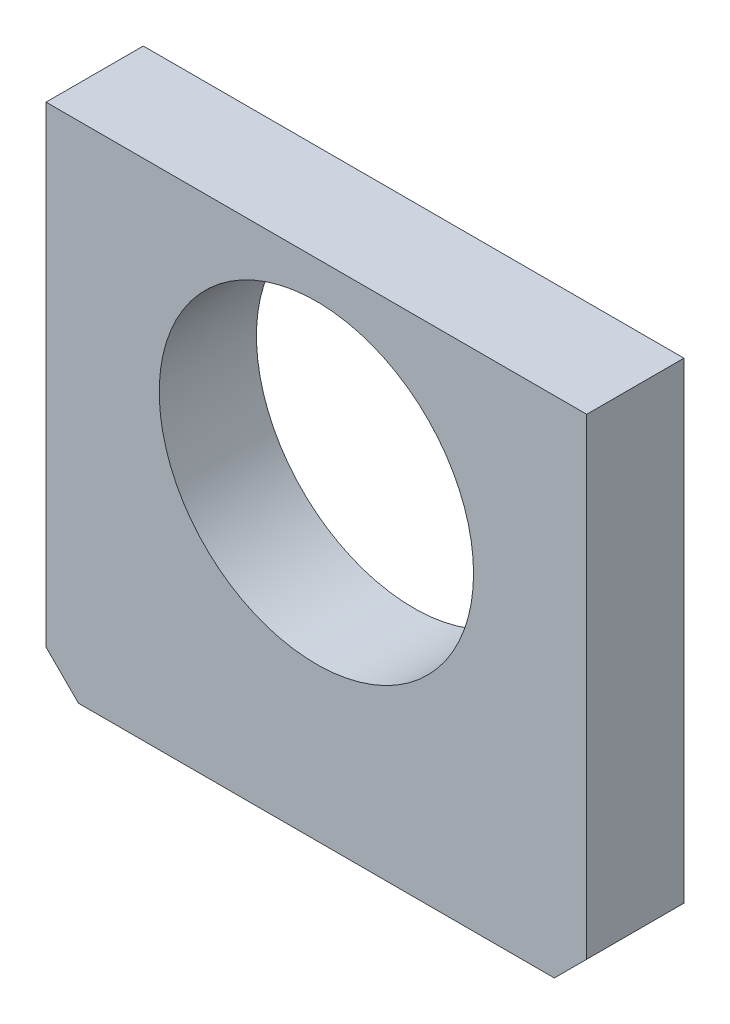
ISO-10303-21;
HEADER;
FILE_DESCRIPTION(('STEP AP214'),'2;1');
FILE_NAME('part.step','',(''),(''),'','','');
FILE_SCHEMA(('AUTOMOTIVE_DESIGN { 1 0 10303 214 1 1 1 1 }'));
ENDSEC;
DATA;
#1=APPLICATION_CONTEXT('core data for automotive mechanical design processes');
#2=APPLICATION_PROTOCOL_DEFINITION('international standard','automotive_design',2000,#1);
#3=PRODUCT_CONTEXT('',#1,'mechanical');
#4=PRODUCT('Part','Part','',(#3));
#5=PRODUCT_RELATED_PRODUCT_CATEGORY('part','',(#4));
#6=PRODUCT_DEFINITION_FORMATION('','',#4);
#7=PRODUCT_DEFINITION_CONTEXT('part definition',#1,'design');
#8=PRODUCT_DEFINITION('design','',#6,#7);
#9=PRODUCT_DEFINITION_SHAPE('','',#8);
#10=(LENGTH_UNIT() NAMED_UNIT(*) SI_UNIT(.MILLI.,.METRE.));
#11=(NAMED_UNIT(*) PLANE_ANGLE_UNIT() SI_UNIT($,.RADIAN.));
#12=(NAMED_UNIT(*) SI_UNIT($,.STERADIAN.) SOLID_ANGLE_UNIT());
#13=UNCERTAINTY_MEASURE_WITH_UNIT(LENGTH_MEASURE(1.E-05),#10,'distance_accuracy_value','');
#14=(GEOMETRIC_REPRESENTATION_CONTEXT(3) GLOBAL_UNCERTAINTY_ASSIGNED_CONTEXT((#13)) GLOBAL_UNIT_ASSIGNED_CONTEXT((#10,
#11,#12)) REPRESENTATION_CONTEXT('',''));
#15=CARTESIAN_POINT('',(0.,0.,0.));
#16=DIRECTION('',(0.,0.,1.));
#17=DIRECTION('',(1.,0.,0.));
#18=AXIS2_PLACEMENT_3D('',#15,#16,#17);
#19=CARTESIAN_POINT('',(52.9749999969755,495.506289326684,-19.05));
#20=DIRECTION('',(1.,0.,0.));
#21=DIRECTION('',(0.,1.,0.));
#22=AXIS2_PLACEMENT_3D('',#19,#20,#21);
#23=PLANE('',#22);
#24=DIRECTION('',(0.,1.,0.));
#25=VECTOR('',#24,1.);
#26=CARTESIAN_POINT('',(52.9749999969755,495.506289326684,0.));
#27=LINE('',#26,#25);
#28=CARTESIAN_POINT('',(52.9749999969745,403.012638398687,0.));
#29=VERTEX_POINT('',#28);
#30=CARTESIAN_POINT('',(52.9749999969755,495.506289326684,0.));
#31=VERTEX_POINT('',#30);
#32=EDGE_CURVE('E117',#29,#31,#27,.T.);
#33=ORIENTED_EDGE('',*,*,#32,.F.);
#34=DIRECTION('',(0.,0.,-1.));
#35=VECTOR('',#34,1.);
#36=CARTESIAN_POINT('',(52.9749999969745,403.012638398687,-19.05));
#37=LINE('',#36,#35);
#38=CARTESIAN_POINT('',(52.9749999969745,403.012638398687,-19.05));
#39=VERTEX_POINT('',#38);
#40=EDGE_CURVE('E61',#29,#39,#37,.T.);
#41=ORIENTED_EDGE('',*,*,#40,.T.);
#42=DIRECTION('',(0.,1.,0.));
#43=VECTOR('',#42,1.);
#44=CARTESIAN_POINT('',(52.9749999969755,495.506289326684,-19.05));
#45=LINE('',#44,#43);
#46=CARTESIAN_POINT('',(52.9749999969755,495.506289326684,-19.05));
#47=VERTEX_POINT('',#46);
#48=EDGE_CURVE('E92',#39,#47,#45,.T.);
#49=ORIENTED_EDGE('',*,*,#48,.T.);
#50=DIRECTION('',(0.,0.,1.));
#51=VECTOR('',#50,1.);
#52=CARTESIAN_POINT('',(52.9749999969755,495.506289326684,-19.05));
#53=LINE('',#52,#51);
#54=EDGE_CURVE('E94',#47,#31,#53,.T.);
#55=ORIENTED_EDGE('',*,*,#54,.T.);
#56=EDGE_LOOP('',(#33,#41,#49,#55));
#57=FACE_BOUND('',#56,.T.);
#58=ADVANCED_FACE('F37',(#57),#23,.T.);
#59=CARTESIAN_POINT('',(52.9749999969744,396.662638398687,-19.05));
#60=DIRECTION('',(0.,-1.,0.));
#61=DIRECTION('',(0.,0.,-1.));
#62=AXIS2_PLACEMENT_3D('',#59,#60,#61);
#63=PLANE('',#62);
#64=DIRECTION('',(1.,0.,0.));
#65=VECTOR('',#64,1.);
#66=CARTESIAN_POINT('',(52.9749999969744,396.662638398687,-19.05));
#67=LINE('',#66,#65);
#68=CARTESIAN_POINT('',(-46.6249999970027,396.662638398687,-19.05));
#69=VERTEX_POINT('',#68);
#70=CARTESIAN_POINT('',(46.6249999969743,396.662638398687,-19.05));
#71=VERTEX_POINT('',#70);
#72=EDGE_CURVE('E107',#69,#71,#67,.T.);
#73=ORIENTED_EDGE('',*,*,#72,.T.);
#74=DIRECTION('',(0.,0.,1.));
#75=VECTOR('',#74,1.);
#76=CARTESIAN_POINT('',(46.6249999969743,396.662638398687,-19.05));
#77=LINE('',#76,#75);
#78=CARTESIAN_POINT('',(46.6249999969743,396.662638398687,0.));
#79=VERTEX_POINT('',#78);
#80=EDGE_CURVE('E129',#71,#79,#77,.T.);
#81=ORIENTED_EDGE('',*,*,#80,.T.);
#82=DIRECTION('',(1.,0.,0.));
#83=VECTOR('',#82,1.);
#84=CARTESIAN_POINT('',(52.9749999969744,396.662638398687,0.));
#85=LINE('',#84,#83);
#86=CARTESIAN_POINT('',(-46.6249999970027,396.662638398687,0.));
#87=VERTEX_POINT('',#86);
#88=EDGE_CURVE('E99',#87,#79,#85,.T.);
#89=ORIENTED_EDGE('',*,*,#88,.F.);
#90=DIRECTION('',(0.,0.,-1.));
#91=VECTOR('',#90,1.);
#92=CARTESIAN_POINT('',(-46.6249999970027,396.662638398687,-19.05));
#93=LINE('',#92,#91);
#94=EDGE_CURVE('E126',#87,#69,#93,.T.);
#95=ORIENTED_EDGE('',*,*,#94,.T.);
#96=EDGE_LOOP('',(#73,#81,#89,#95));
#97=FACE_BOUND('',#96,.T.);
#98=ADVANCED_FACE('F140',(#97),#63,.T.);
#99=CARTESIAN_POINT('',(-52.9749999970028,495.506289326683,-19.05));
#100=DIRECTION('',(-1.,0.,0.));
#101=DIRECTION('',(0.,-1.,0.));
#102=AXIS2_PLACEMENT_3D('',#99,#100,#101);
#103=PLANE('',#102);
#104=DIRECTION('',(0.,-1.,0.));
#105=VECTOR('',#104,1.);
#106=CARTESIAN_POINT('',(-52.9749999970028,495.506289326683,-19.05));
#107=LINE('',#106,#105);
#108=CARTESIAN_POINT('',(-52.9749999970028,495.506289326683,-19.05));
#109=VERTEX_POINT('',#108);
#110=CARTESIAN_POINT('',(-52.9749999970027,403.012638398687,-19.05));
#111=VERTEX_POINT('',#110);
#112=EDGE_CURVE('E110',#109,#111,#107,.T.);
#113=ORIENTED_EDGE('',*,*,#112,.T.);
#114=DIRECTION('',(0.,0.,1.));
#115=VECTOR('',#114,1.);
#116=CARTESIAN_POINT('',(-52.9749999970027,403.012638398687,-19.05));
#117=LINE('',#116,#115);
#118=CARTESIAN_POINT('',(-52.9749999970027,403.012638398687,0.));
#119=VERTEX_POINT('',#118);
#120=EDGE_CURVE('E11',#111,#119,#117,.T.);
#121=ORIENTED_EDGE('',*,*,#120,.T.);
#122=DIRECTION('',(0.,-1.,0.));
#123=VECTOR('',#122,1.);
#124=CARTESIAN_POINT('',(-52.9749999970028,495.506289326683,0.));
#125=LINE('',#124,#123);
#126=CARTESIAN_POINT('',(-52.9749999970028,495.506289326683,0.));
#127=VERTEX_POINT('',#126);
#128=EDGE_CURVE('E121',#127,#119,#125,.T.);
#129=ORIENTED_EDGE('',*,*,#128,.F.);
#130=DIRECTION('',(0.,0.,1.));
#131=VECTOR('',#130,1.);
#132=CARTESIAN_POINT('',(-52.9749999970028,495.506289326683,-19.05));
#133=LINE('',#132,#131);
#134=EDGE_CURVE('E106',#109,#127,#133,.T.);
#135=ORIENTED_EDGE('',*,*,#134,.F.);
#136=EDGE_LOOP('',(#113,#121,#129,#135));
#137=FACE_BOUND('',#136,.T.);
#138=ADVANCED_FACE('F150',(#137),#103,.T.);
#139=CARTESIAN_POINT('',(52.9749999969755,495.506289326684,-19.05));
#140=DIRECTION('',(0.,1.,0.));
#141=DIRECTION('',(-1.,0.,0.));
#142=AXIS2_PLACEMENT_3D('',#139,#140,#141);
#143=PLANE('',#142);
#144=DIRECTION('',(-1.,0.,0.));
#145=VECTOR('',#144,1.);
#146=CARTESIAN_POINT('',(52.9749999969755,495.506289326684,0.));
#147=LINE('',#146,#145);
#148=EDGE_CURVE('E105',#31,#127,#147,.T.);
#149=ORIENTED_EDGE('',*,*,#148,.F.);
#150=ORIENTED_EDGE('',*,*,#54,.F.);
#151=DIRECTION('',(-1.,0.,0.));
#152=VECTOR('',#151,1.);
#153=CARTESIAN_POINT('',(52.9749999969755,495.506289326684,-19.05));
#154=LINE('',#153,#152);
#155=EDGE_CURVE('E98',#47,#109,#154,.T.);
#156=ORIENTED_EDGE('',*,*,#155,.T.);
#157=ORIENTED_EDGE('',*,*,#134,.T.);
#158=EDGE_LOOP('',(#149,#150,#156,#157));
#159=FACE_BOUND('',#158,.T.);
#160=ADVANCED_FACE('F103',(#159),#143,.T.);
#161=CARTESIAN_POINT('',(0.,0.,-19.05));
#162=DIRECTION('',(0.,0.,-1.));
#163=DIRECTION('',(-1.,0.,0.));
#164=AXIS2_PLACEMENT_3D('',#161,#162,#163);
#165=PLANE('',#164);
#166=CARTESIAN_POINT('',(-1.2687073613904E-10,457.406289235242,-19.05));
#167=DIRECTION('',(0.,0.,1.));
#168=DIRECTION('',(1.,0.,0.));
#169=AXIS2_PLACEMENT_3D('',#166,#167,#168);
#170=CIRCLE('',#169,30.7975000000048);
#171=CARTESIAN_POINT('',(30.7974999998779,457.406289235242,-19.05));
#172=VERTEX_POINT('',#171);
#173=EDGE_CURVE('E119',#172,#172,#170,.T.);
#174=ORIENTED_EDGE('',*,*,#173,.T.);
#175=EDGE_LOOP('',(#174));
#176=FACE_BOUND('',#175,.T.);
#177=ORIENTED_EDGE('',*,*,#48,.F.);
#178=DIRECTION('',(0.707106781186554,0.707106781186541,0.));
#179=VECTOR('',#178,1.);
#180=CARTESIAN_POINT('',(-175.018819200857,175.01881920086,-19.05));
#181=LINE('',#180,#179);
#182=EDGE_CURVE('E46',#39,#71,#181,.F.);
#183=ORIENTED_EDGE('',*,*,#182,.T.);
#184=ORIENTED_EDGE('',*,*,#72,.F.);
#185=DIRECTION('',(0.707106781186546,-0.707106781186549,0.));
#186=VECTOR('',#185,1.);
#187=CARTESIAN_POINT('',(175.018819200842,175.018819200841,-19.05));
#188=LINE('',#187,#186);
#189=EDGE_CURVE('E53',#69,#111,#188,.F.);
#190=ORIENTED_EDGE('',*,*,#189,.T.);
#191=ORIENTED_EDGE('',*,*,#112,.F.);
#192=ORIENTED_EDGE('',*,*,#155,.F.);
#193=EDGE_LOOP('',(#177,#183,#184,#190,#191,#192));
#194=FACE_BOUND('',#193,.T.);
#195=ADVANCED_FACE('F109',(#176,#194),#165,.T.);
#196=CARTESIAN_POINT('',(0.,0.,0.));
#197=DIRECTION('',(0.,0.,-1.));
#198=DIRECTION('',(-1.,0.,0.));
#199=AXIS2_PLACEMENT_3D('',#196,#197,#198);
#200=PLANE('',#199);
#201=CARTESIAN_POINT('',(-1.2687073613904E-10,457.406289235242,0.));
#202=DIRECTION('',(0.,0.,1.));
#203=DIRECTION('',(1.,0.,0.));
#204=AXIS2_PLACEMENT_3D('',#201,#202,#203);
#205=CIRCLE('',#204,30.7975000000048);
#206=CARTESIAN_POINT('',(30.7974999998779,457.406289235242,0.));
#207=VERTEX_POINT('',#206);
#208=EDGE_CURVE('E187',#207,#207,#205,.T.);
#209=ORIENTED_EDGE('',*,*,#208,.F.);
#210=EDGE_LOOP('',(#209));
#211=FACE_BOUND('',#210,.T.);
#212=ORIENTED_EDGE('',*,*,#88,.T.);
#213=DIRECTION('',(-0.707106781186554,-0.707106781186541,0.));
#214=VECTOR('',#213,1.);
#215=CARTESIAN_POINT('',(46.6249999969743,396.662638398687,0.));
#216=LINE('',#215,#214);
#217=EDGE_CURVE('E134',#79,#29,#216,.F.);
#218=ORIENTED_EDGE('',*,*,#217,.T.);
#219=ORIENTED_EDGE('',*,*,#32,.T.);
#220=ORIENTED_EDGE('',*,*,#148,.T.);
#221=ORIENTED_EDGE('',*,*,#128,.T.);
#222=DIRECTION('',(-0.707106781186546,0.707106781186549,0.));
#223=VECTOR('',#222,1.);
#224=CARTESIAN_POINT('',(-52.9749999970027,403.012638398687,0.));
#225=LINE('',#224,#223);
#226=EDGE_CURVE('E132',#119,#87,#225,.F.);
#227=ORIENTED_EDGE('',*,*,#226,.T.);
#228=EDGE_LOOP('',(#212,#218,#219,#220,#221,#227));
#229=FACE_BOUND('',#228,.T.);
#230=ADVANCED_FACE('F145',(#211,#229),#200,.F.);
#231=CARTESIAN_POINT('',(-1.2687073613904E-10,457.406289235242,-19.05));
#232=DIRECTION('',(0.,0.,1.));
#233=DIRECTION('',(1.,0.,0.));
#234=AXIS2_PLACEMENT_3D('',#231,#232,#233);
#235=CYLINDRICAL_SURFACE('',#234,30.7975000000048);
#236=CARTESIAN_POINT('',(30.7974999998779,457.406289235242,-19.05));
#237=CARTESIAN_POINT('',(30.7974999998779,457.406289235242,-18.8515625));
#238=CARTESIAN_POINT('',(30.7974999998779,457.406289235242,-18.653125));
#239=CARTESIAN_POINT('',(30.7974999998779,457.406289235242,-18.25625));
#240=CARTESIAN_POINT('',(30.7974999998779,457.406289235242,-18.0578125));
#241=CARTESIAN_POINT('',(30.7974999998779,457.406289235242,-17.6609375));
#242=CARTESIAN_POINT('',(30.7974999998779,457.406289235242,-17.4625));
#243=CARTESIAN_POINT('',(30.7974999998779,457.406289235242,-17.065625));
#244=CARTESIAN_POINT('',(30.7974999998779,457.406289235242,-16.8671875));
#245=CARTESIAN_POINT('',(30.7974999998779,457.406289235242,-16.4703125));
#246=CARTESIAN_POINT('',(30.7974999998779,457.406289235242,-16.271875));
#247=CARTESIAN_POINT('',(30.7974999998779,457.406289235242,-15.875));
#248=CARTESIAN_POINT('',(30.7974999998779,457.406289235242,-15.6765625));
#249=CARTESIAN_POINT('',(30.7974999998779,457.406289235242,-15.2796875));
#250=CARTESIAN_POINT('',(30.7974999998779,457.406289235242,-15.08125));
#251=CARTESIAN_POINT('',(30.7974999998779,457.406289235242,-14.684375));
#252=CARTESIAN_POINT('',(30.7974999998779,457.406289235242,-14.4859375));
#253=CARTESIAN_POINT('',(30.7974999998779,457.406289235242,-14.0890625));
#254=CARTESIAN_POINT('',(30.7974999998779,457.406289235242,-13.890625));
#255=CARTESIAN_POINT('',(30.7974999998779,457.406289235242,-13.49375));
#256=CARTESIAN_POINT('',(30.7974999998779,457.406289235242,-13.2953125));
#257=CARTESIAN_POINT('',(30.7974999998779,457.406289235242,-12.8984375));
#258=CARTESIAN_POINT('',(30.7974999998779,457.406289235242,-12.7));
#259=CARTESIAN_POINT('',(30.7974999998779,457.406289235242,-12.303125));
#260=CARTESIAN_POINT('',(30.7974999998779,457.406289235242,-12.1046875));
#261=CARTESIAN_POINT('',(30.7974999998779,457.406289235242,-11.7078125));
#262=CARTESIAN_POINT('',(30.7974999998779,457.406289235242,-11.509375));
#263=CARTESIAN_POINT('',(30.7974999998779,457.406289235242,-11.1125));
#264=CARTESIAN_POINT('',(30.7974999998779,457.406289235242,-10.9140625));
#265=CARTESIAN_POINT('',(30.7974999998779,457.406289235242,-10.5171875));
#266=CARTESIAN_POINT('',(30.7974999998779,457.406289235242,-10.31875));
#267=CARTESIAN_POINT('',(30.7974999998779,457.406289235242,-9.921875));
#268=CARTESIAN_POINT('',(30.7974999998779,457.406289235242,-9.7234375));
#269=CARTESIAN_POINT('',(30.7974999998779,457.406289235242,-9.3265625));
#270=CARTESIAN_POINT('',(30.7974999998779,457.406289235242,-9.128125));
#271=CARTESIAN_POINT('',(30.7974999998779,457.406289235242,-8.73125));
#272=CARTESIAN_POINT('',(30.7974999998779,457.406289235242,-8.5328125));
#273=CARTESIAN_POINT('',(30.7974999998779,457.406289235242,-8.1359375));
#274=CARTESIAN_POINT('',(30.7974999998779,457.406289235242,-7.9375));
#275=CARTESIAN_POINT('',(30.7974999998779,457.406289235242,-7.540625));
#276=CARTESIAN_POINT('',(30.7974999998779,457.406289235242,-7.3421875));
#277=CARTESIAN_POINT('',(30.7974999998779,457.406289235242,-6.9453125));
#278=CARTESIAN_POINT('',(30.7974999998779,457.406289235242,-6.746875));
#279=CARTESIAN_POINT('',(30.7974999998779,457.406289235242,-6.35));
#280=CARTESIAN_POINT('',(30.7974999998779,457.406289235242,-6.1515625));
#281=CARTESIAN_POINT('',(30.7974999998779,457.406289235242,-5.7546875));
#282=CARTESIAN_POINT('',(30.7974999998779,457.406289235242,-5.55625));
#283=CARTESIAN_POINT('',(30.7974999998779,457.406289235242,-5.159375));
#284=CARTESIAN_POINT('',(30.7974999998779,457.406289235242,-4.9609375));
#285=CARTESIAN_POINT('',(30.7974999998779,457.406289235242,-4.5640625));
#286=CARTESIAN_POINT('',(30.7974999998779,457.406289235242,-4.365625));
#287=CARTESIAN_POINT('',(30.7974999998779,457.406289235242,-3.96875));
#288=CARTESIAN_POINT('',(30.7974999998779,457.406289235242,-3.7703125));
#289=CARTESIAN_POINT('',(30.7974999998779,457.406289235242,-3.3734375));
#290=CARTESIAN_POINT('',(30.7974999998779,457.406289235242,-3.175));
#291=CARTESIAN_POINT('',(30.7974999998779,457.406289235242,-2.778125));
#292=CARTESIAN_POINT('',(30.7974999998779,457.406289235242,-2.5796875));
#293=CARTESIAN_POINT('',(30.7974999998779,457.406289235242,-2.1828125));
#294=CARTESIAN_POINT('',(30.7974999998779,457.406289235242,-1.984375));
#295=CARTESIAN_POINT('',(30.7974999998779,457.406289235242,-1.5875));
#296=CARTESIAN_POINT('',(30.7974999998779,457.406289235242,-1.3890625));
#297=CARTESIAN_POINT('',(30.7974999998779,457.406289235242,-0.992187500000001));
#298=CARTESIAN_POINT('',(30.7974999998779,457.406289235242,-0.793750000000001));
#299=CARTESIAN_POINT('',(30.7974999998779,457.406289235242,-0.396875));
#300=CARTESIAN_POINT('',(30.7974999998779,457.406289235242,-0.1984375));
#301=CARTESIAN_POINT('',(30.7974999998779,457.406289235242,0.));
#302=B_SPLINE_CURVE_WITH_KNOTS('',3,(#236,#237,#238,#239,#240,#241,#242,#243,#244,#245,#246,
#247,#248,#249,#250,#251,#252,#253,#254,#255,#256,#257,#258,#259,#260,#261,#262,#263,#264,#265,
#266,#267,#268,#269,#270,#271,#272,#273,#274,#275,#276,#277,#278,#279,#280,#281,#282,#283,#284,
#285,#286,#287,#288,#289,#290,#291,#292,#293,#294,#295,#296,#297,#298,#299,#300,#301),
.UNSPECIFIED.,.F.,.F.,(4,2,2,2,2,2,2,2,2,2,2,2,2,2,2,2,2,2,2,2,2,2,2,2,2,2,2,2,2,2,2,2,4),(0.,
0.5953125,1.190625,1.7859375,2.38125,2.9765625,3.571875,4.1671875,4.7625,5.3578125,5.953125,
6.5484375,7.14375,7.7390625,8.334375,8.9296875,9.525,10.1203125,10.715625,11.3109375,11.90625,
12.5015625,13.096875,13.6921875,14.2875,14.8828125,15.478125,16.0734375,16.66875,17.2640625,
17.859375,18.4546875,19.05),.UNSPECIFIED.);
#303=EDGE_CURVE('BSEAM167',#172,#207,#302,.T.);
#304=ORIENTED_EDGE('',*,*,#173,.F.);
#305=ORIENTED_EDGE('',*,*,#208,.T.);
#306=ORIENTED_EDGE('',*,*,#303,.T.);
#307=ORIENTED_EDGE('',*,*,#303,.F.);
#308=EDGE_LOOP('',(#304,#306,#305,#307));
#309=FACE_BOUND('',#308,.T.);
#310=ADVANCED_FACE('F167',(#309),#235,.F.);
#311=CARTESIAN_POINT('',(46.6249999969743,396.662638398687,-19.05));
#312=DIRECTION('',(-0.707106781186541,0.707106781186554,0.));
#313=DIRECTION('',(0.,0.,1.));
#314=AXIS2_PLACEMENT_3D('',#311,#312,#313);
#315=PLANE('',#314);
#316=ORIENTED_EDGE('',*,*,#182,.F.);
#317=ORIENTED_EDGE('',*,*,#40,.F.);
#318=ORIENTED_EDGE('',*,*,#217,.F.);
#319=ORIENTED_EDGE('',*,*,#80,.F.);
#320=EDGE_LOOP('',(#316,#317,#318,#319));
#321=FACE_BOUND('',#320,.T.);
#322=ADVANCED_FACE('F143',(#321),#315,.F.);
#323=CARTESIAN_POINT('',(-52.9749999970027,403.012638398687,-19.05));
#324=DIRECTION('',(0.707106781186549,0.707106781186546,0.));
#325=DIRECTION('',(0.,0.,1.));
#326=AXIS2_PLACEMENT_3D('',#323,#324,#325);
#327=PLANE('',#326);
#328=ORIENTED_EDGE('',*,*,#189,.F.);
#329=ORIENTED_EDGE('',*,*,#94,.F.);
#330=ORIENTED_EDGE('',*,*,#226,.F.);
#331=ORIENTED_EDGE('',*,*,#120,.F.);
#332=EDGE_LOOP('',(#328,#329,#330,#331));
#333=FACE_BOUND('',#332,.T.);
#334=ADVANCED_FACE('F40',(#333),#327,.F.);
#335=CLOSED_SHELL('',(#58,#98,#138,#160,#195,#230,#310,#322,#334));
#336=MANIFOLD_SOLID_BREP('B2',#335);
#337=ADVANCED_BREP_SHAPE_REPRESENTATION('',(#18,#336),#14);
#338=SHAPE_DEFINITION_REPRESENTATION(#9,#337);
ENDSEC;
END-ISO-10303-21;
